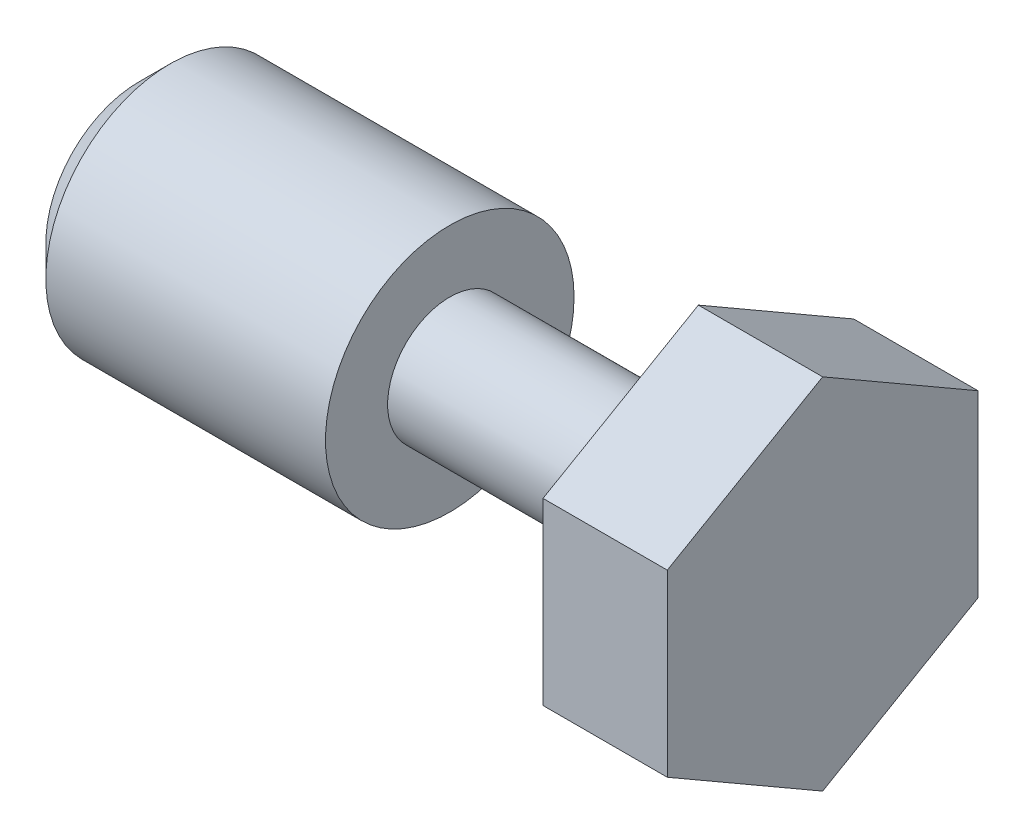
ISO-10303-21;
HEADER;
FILE_DESCRIPTION(('STEP AP214'),'2;1');
FILE_NAME('part.step','',(''),(''),'','','');
FILE_SCHEMA(('AUTOMOTIVE_DESIGN { 1 0 10303 214 1 1 1 1 }'));
ENDSEC;
DATA;
#1=APPLICATION_CONTEXT('core data for automotive mechanical design processes');
#2=APPLICATION_PROTOCOL_DEFINITION('international standard','automotive_design',2000,#1);
#3=PRODUCT_CONTEXT('',#1,'mechanical');
#4=PRODUCT('Part','Part','',(#3));
#5=PRODUCT_RELATED_PRODUCT_CATEGORY('part','',(#4));
#6=PRODUCT_DEFINITION_FORMATION('','',#4);
#7=PRODUCT_DEFINITION_CONTEXT('part definition',#1,'design');
#8=PRODUCT_DEFINITION('design','',#6,#7);
#9=PRODUCT_DEFINITION_SHAPE('','',#8);
#10=(LENGTH_UNIT() NAMED_UNIT(*) SI_UNIT(.MILLI.,.METRE.));
#11=(NAMED_UNIT(*) PLANE_ANGLE_UNIT() SI_UNIT($,.RADIAN.));
#12=(NAMED_UNIT(*) SI_UNIT($,.STERADIAN.) SOLID_ANGLE_UNIT());
#13=UNCERTAINTY_MEASURE_WITH_UNIT(LENGTH_MEASURE(1.E-05),#10,'distance_accuracy_value','');
#14=(GEOMETRIC_REPRESENTATION_CONTEXT(3) GLOBAL_UNCERTAINTY_ASSIGNED_CONTEXT((#13)) GLOBAL_UNIT_ASSIGNED_CONTEXT((#10,
#11,#12)) REPRESENTATION_CONTEXT('',''));
#15=CARTESIAN_POINT('',(0.,0.,0.));
#16=DIRECTION('',(0.,0.,1.));
#17=DIRECTION('',(1.,0.,0.));
#18=AXIS2_PLACEMENT_3D('',#15,#16,#17);
#19=CARTESIAN_POINT('',(5.,0.,0.));
#20=DIRECTION('',(-1.,0.,0.));
#21=DIRECTION('',(0.,0.,1.));
#22=AXIS2_PLACEMENT_3D('',#19,#20,#21);
#23=CYLINDRICAL_SURFACE('',#22,2.);
#24=CARTESIAN_POINT('',(0.5,0.,0.));
#25=DIRECTION('',(1.,0.,0.));
#26=DIRECTION('',(0.,0.,-1.));
#27=AXIS2_PLACEMENT_3D('',#24,#25,#26);
#28=CIRCLE('',#27,2.);
#29=CARTESIAN_POINT('',(0.5,0.,-2.));
#30=VERTEX_POINT('',#29);
#31=EDGE_CURVE('E49',#30,#30,#28,.T.);
#32=ORIENTED_EDGE('',*,*,#31,.T.);
#33=EDGE_LOOP('',(#32));
#34=FACE_BOUND('',#33,.T.);
#35=CARTESIAN_POINT('',(5.,0.,0.));
#36=DIRECTION('',(1.,0.,0.));
#37=DIRECTION('',(0.,0.,-1.));
#38=AXIS2_PLACEMENT_3D('',#35,#36,#37);
#39=CIRCLE('',#38,2.);
#40=CARTESIAN_POINT('',(5.,0.,-2.));
#41=VERTEX_POINT('',#40);
#42=EDGE_CURVE('E148',#41,#41,#39,.T.);
#43=ORIENTED_EDGE('',*,*,#42,.F.);
#44=EDGE_LOOP('',(#43));
#45=FACE_BOUND('',#44,.T.);
#46=ADVANCED_FACE('F39',(#34,#45),#23,.T.);
#47=CARTESIAN_POINT('',(5.,0.,0.));
#48=DIRECTION('',(1.,0.,0.));
#49=DIRECTION('',(0.,0.,-1.));
#50=AXIS2_PLACEMENT_3D('',#47,#48,#49);
#51=PLANE('',#50);
#52=CARTESIAN_POINT('',(5.,0.,0.));
#53=DIRECTION('',(1.,0.,0.));
#54=DIRECTION('',(0.,0.,-1.));
#55=AXIS2_PLACEMENT_3D('',#52,#53,#54);
#56=CIRCLE('',#55,1.);
#57=CARTESIAN_POINT('',(5.,0.,-1.));
#58=VERTEX_POINT('',#57);
#59=EDGE_CURVE('E149',#58,#58,#56,.T.);
#60=ORIENTED_EDGE('',*,*,#59,.F.);
#61=EDGE_LOOP('',(#60));
#62=FACE_BOUND('',#61,.T.);
#63=ORIENTED_EDGE('',*,*,#42,.T.);
#64=EDGE_LOOP('',(#63));
#65=FACE_BOUND('',#64,.T.);
#66=ADVANCED_FACE('F168',(#62,#65),#51,.T.);
#67=CARTESIAN_POINT('',(0.,0.,0.));
#68=DIRECTION('',(1.,0.,0.));
#69=DIRECTION('',(0.,0.,-1.));
#70=AXIS2_PLACEMENT_3D('',#67,#68,#69);
#71=PLANE('',#70);
#72=CARTESIAN_POINT('',(0.,0.,0.));
#73=DIRECTION('',(1.,0.,0.));
#74=DIRECTION('',(0.,0.,-1.));
#75=AXIS2_PLACEMENT_3D('',#72,#73,#74);
#76=CIRCLE('',#75,1.5);
#77=CARTESIAN_POINT('',(0.,0.,-1.5));
#78=VERTEX_POINT('',#77);
#79=EDGE_CURVE('E11',#78,#78,#76,.F.);
#80=ORIENTED_EDGE('',*,*,#79,.T.);
#81=EDGE_LOOP('',(#80));
#82=FACE_BOUND('',#81,.T.);
#83=ADVANCED_FACE('F172',(#82),#71,.F.);
#84=CARTESIAN_POINT('',(9.,0.,0.));
#85=DIRECTION('',(-1.,0.,0.));
#86=DIRECTION('',(0.,0.,1.));
#87=AXIS2_PLACEMENT_3D('',#84,#85,#86);
#88=CYLINDRICAL_SURFACE('',#87,1.);
#89=CARTESIAN_POINT('',(9.,0.,0.));
#90=DIRECTION('',(1.,0.,0.));
#91=DIRECTION('',(0.,0.,-1.));
#92=AXIS2_PLACEMENT_3D('',#89,#90,#91);
#93=CIRCLE('',#92,1.);
#94=CARTESIAN_POINT('',(9.,0.,-1.));
#95=VERTEX_POINT('',#94);
#96=EDGE_CURVE('E145',#95,#95,#93,.T.);
#97=ORIENTED_EDGE('',*,*,#96,.F.);
#98=EDGE_LOOP('',(#97));
#99=FACE_BOUND('',#98,.T.);
#100=ORIENTED_EDGE('',*,*,#59,.T.);
#101=EDGE_LOOP('',(#100));
#102=FACE_BOUND('',#101,.T.);
#103=ADVANCED_FACE('F177',(#99,#102),#88,.T.);
#104=CARTESIAN_POINT('',(11.,-1.44337567297406,2.5));
#105=DIRECTION('',(0.,0.866025403784439,-0.5));
#106=DIRECTION('',(0.,0.5,0.866025403784439));
#107=AXIS2_PLACEMENT_3D('',#104,#105,#106);
#108=PLANE('',#107);
#109=DIRECTION('',(0.,-0.5,-0.866025403784439));
#110=VECTOR('',#109,1.);
#111=CARTESIAN_POINT('',(9.,-1.44337567297406,2.5));
#112=LINE('',#111,#110);
#113=CARTESIAN_POINT('',(9.,-1.44337567297406,2.5));
#114=VERTEX_POINT('',#113);
#115=CARTESIAN_POINT('',(9.,-2.88675134594813,0.));
#116=VERTEX_POINT('',#115);
#117=EDGE_CURVE('E126',#114,#116,#112,.T.);
#118=ORIENTED_EDGE('',*,*,#117,.T.);
#119=DIRECTION('',(-1.,0.,0.));
#120=VECTOR('',#119,1.);
#121=CARTESIAN_POINT('',(11.,-2.88675134594813,0.));
#122=LINE('',#121,#120);
#123=CARTESIAN_POINT('',(11.,-2.88675134594813,0.));
#124=VERTEX_POINT('',#123);
#125=EDGE_CURVE('E143',#124,#116,#122,.T.);
#126=ORIENTED_EDGE('',*,*,#125,.F.);
#127=DIRECTION('',(0.,-0.5,-0.866025403784439));
#128=VECTOR('',#127,1.);
#129=CARTESIAN_POINT('',(11.,-1.44337567297406,2.5));
#130=LINE('',#129,#128);
#131=CARTESIAN_POINT('',(11.,-1.44337567297406,2.5));
#132=VERTEX_POINT('',#131);
#133=EDGE_CURVE('E136',#132,#124,#130,.T.);
#134=ORIENTED_EDGE('',*,*,#133,.F.);
#135=DIRECTION('',(-1.,0.,0.));
#136=VECTOR('',#135,1.);
#137=CARTESIAN_POINT('',(11.,-1.44337567297406,2.5));
#138=LINE('',#137,#136);
#139=EDGE_CURVE('E122',#132,#114,#138,.T.);
#140=ORIENTED_EDGE('',*,*,#139,.T.);
#141=EDGE_LOOP('',(#118,#126,#134,#140));
#142=FACE_BOUND('',#141,.T.);
#143=ADVANCED_FACE('F182',(#142),#108,.F.);
#144=CARTESIAN_POINT('',(11.,-2.88675134594813,0.));
#145=DIRECTION('',(0.,0.866025403784439,0.5));
#146=DIRECTION('',(0.,-0.5,0.866025403784439));
#147=AXIS2_PLACEMENT_3D('',#144,#145,#146);
#148=PLANE('',#147);
#149=DIRECTION('',(0.,0.5,-0.866025403784439));
#150=VECTOR('',#149,1.);
#151=CARTESIAN_POINT('',(9.,-2.88675134594813,0.));
#152=LINE('',#151,#150);
#153=CARTESIAN_POINT('',(9.,-1.44337567297406,-2.5));
#154=VERTEX_POINT('',#153);
#155=EDGE_CURVE('E129',#116,#154,#152,.T.);
#156=ORIENTED_EDGE('',*,*,#155,.T.);
#157=DIRECTION('',(-1.,0.,0.));
#158=VECTOR('',#157,1.);
#159=CARTESIAN_POINT('',(11.,-1.44337567297406,-2.5));
#160=LINE('',#159,#158);
#161=CARTESIAN_POINT('',(11.,-1.44337567297406,-2.5));
#162=VERTEX_POINT('',#161);
#163=EDGE_CURVE('E140',#162,#154,#160,.T.);
#164=ORIENTED_EDGE('',*,*,#163,.F.);
#165=DIRECTION('',(0.,0.5,-0.866025403784439));
#166=VECTOR('',#165,1.);
#167=CARTESIAN_POINT('',(11.,-2.88675134594813,0.));
#168=LINE('',#167,#166);
#169=EDGE_CURVE('E95',#124,#162,#168,.T.);
#170=ORIENTED_EDGE('',*,*,#169,.F.);
#171=ORIENTED_EDGE('',*,*,#125,.T.);
#172=EDGE_LOOP('',(#156,#164,#170,#171));
#173=FACE_BOUND('',#172,.T.);
#174=ADVANCED_FACE('F186',(#173),#148,.F.);
#175=CARTESIAN_POINT('',(11.,-1.44337567297406,-2.5));
#176=DIRECTION('',(0.,0.,1.));
#177=DIRECTION('',(1.,0.,0.));
#178=AXIS2_PLACEMENT_3D('',#175,#176,#177);
#179=PLANE('',#178);
#180=DIRECTION('',(0.,1.,0.));
#181=VECTOR('',#180,1.);
#182=CARTESIAN_POINT('',(9.,-1.44337567297406,-2.5));
#183=LINE('',#182,#181);
#184=CARTESIAN_POINT('',(9.,1.44337567297407,-2.5));
#185=VERTEX_POINT('',#184);
#186=EDGE_CURVE('E131',#154,#185,#183,.T.);
#187=ORIENTED_EDGE('',*,*,#186,.T.);
#188=DIRECTION('',(-1.,0.,0.));
#189=VECTOR('',#188,1.);
#190=CARTESIAN_POINT('',(11.,1.44337567297407,-2.5));
#191=LINE('',#190,#189);
#192=CARTESIAN_POINT('',(11.,1.44337567297407,-2.5));
#193=VERTEX_POINT('',#192);
#194=EDGE_CURVE('E117',#193,#185,#191,.T.);
#195=ORIENTED_EDGE('',*,*,#194,.F.);
#196=DIRECTION('',(0.,1.,0.));
#197=VECTOR('',#196,1.);
#198=CARTESIAN_POINT('',(11.,-1.44337567297406,-2.5));
#199=LINE('',#198,#197);
#200=EDGE_CURVE('E108',#162,#193,#199,.T.);
#201=ORIENTED_EDGE('',*,*,#200,.F.);
#202=ORIENTED_EDGE('',*,*,#163,.T.);
#203=EDGE_LOOP('',(#187,#195,#201,#202));
#204=FACE_BOUND('',#203,.T.);
#205=ADVANCED_FACE('F190',(#204),#179,.F.);
#206=CARTESIAN_POINT('',(11.,1.44337567297407,-2.5));
#207=DIRECTION('',(0.,-0.866025403784439,0.5));
#208=DIRECTION('',(0.,-0.5,-0.866025403784439));
#209=AXIS2_PLACEMENT_3D('',#206,#207,#208);
#210=PLANE('',#209);
#211=DIRECTION('',(0.,0.5,0.866025403784439));
#212=VECTOR('',#211,1.);
#213=CARTESIAN_POINT('',(9.,1.44337567297407,-2.5));
#214=LINE('',#213,#212);
#215=CARTESIAN_POINT('',(9.,2.88675134594813,0.));
#216=VERTEX_POINT('',#215);
#217=EDGE_CURVE('E116',#185,#216,#214,.T.);
#218=ORIENTED_EDGE('',*,*,#217,.T.);
#219=DIRECTION('',(-1.,0.,0.));
#220=VECTOR('',#219,1.);
#221=CARTESIAN_POINT('',(11.,2.88675134594813,0.));
#222=LINE('',#221,#220);
#223=CARTESIAN_POINT('',(11.,2.88675134594813,0.));
#224=VERTEX_POINT('',#223);
#225=EDGE_CURVE('E113',#224,#216,#222,.T.);
#226=ORIENTED_EDGE('',*,*,#225,.F.);
#227=DIRECTION('',(0.,0.5,0.866025403784439));
#228=VECTOR('',#227,1.);
#229=CARTESIAN_POINT('',(11.,1.44337567297407,-2.5));
#230=LINE('',#229,#228);
#231=EDGE_CURVE('E102',#193,#224,#230,.T.);
#232=ORIENTED_EDGE('',*,*,#231,.F.);
#233=ORIENTED_EDGE('',*,*,#194,.T.);
#234=EDGE_LOOP('',(#218,#226,#232,#233));
#235=FACE_BOUND('',#234,.T.);
#236=ADVANCED_FACE('F114',(#235),#210,.F.);
#237=CARTESIAN_POINT('',(11.,2.88675134594813,0.));
#238=DIRECTION('',(0.,-0.866025403784438,-0.5));
#239=DIRECTION('',(0.,0.5,-0.866025403784439));
#240=AXIS2_PLACEMENT_3D('',#237,#238,#239);
#241=PLANE('',#240);
#242=DIRECTION('',(0.,-0.5,0.866025403784439));
#243=VECTOR('',#242,1.);
#244=CARTESIAN_POINT('',(9.,2.88675134594813,0.));
#245=LINE('',#244,#243);
#246=CARTESIAN_POINT('',(9.,1.44337567297406,2.5));
#247=VERTEX_POINT('',#246);
#248=EDGE_CURVE('E80',#216,#247,#245,.T.);
#249=ORIENTED_EDGE('',*,*,#248,.T.);
#250=DIRECTION('',(-1.,0.,0.));
#251=VECTOR('',#250,1.);
#252=CARTESIAN_POINT('',(11.,1.44337567297406,2.5));
#253=LINE('',#252,#251);
#254=CARTESIAN_POINT('',(11.,1.44337567297406,2.5));
#255=VERTEX_POINT('',#254);
#256=EDGE_CURVE('E118',#255,#247,#253,.T.);
#257=ORIENTED_EDGE('',*,*,#256,.F.);
#258=DIRECTION('',(0.,-0.5,0.866025403784439));
#259=VECTOR('',#258,1.);
#260=CARTESIAN_POINT('',(11.,2.88675134594813,0.));
#261=LINE('',#260,#259);
#262=EDGE_CURVE('E106',#224,#255,#261,.T.);
#263=ORIENTED_EDGE('',*,*,#262,.F.);
#264=ORIENTED_EDGE('',*,*,#225,.T.);
#265=EDGE_LOOP('',(#249,#257,#263,#264));
#266=FACE_BOUND('',#265,.T.);
#267=ADVANCED_FACE('F120',(#266),#241,.F.);
#268=CARTESIAN_POINT('',(11.,1.44337567297406,2.5));
#269=DIRECTION('',(0.,0.,-1.));
#270=DIRECTION('',(-1.,0.,0.));
#271=AXIS2_PLACEMENT_3D('',#268,#269,#270);
#272=PLANE('',#271);
#273=DIRECTION('',(0.,-1.,0.));
#274=VECTOR('',#273,1.);
#275=CARTESIAN_POINT('',(9.,1.44337567297406,2.5));
#276=LINE('',#275,#274);
#277=EDGE_CURVE('E86',#247,#114,#276,.T.);
#278=ORIENTED_EDGE('',*,*,#277,.T.);
#279=ORIENTED_EDGE('',*,*,#139,.F.);
#280=DIRECTION('',(0.,-1.,0.));
#281=VECTOR('',#280,1.);
#282=CARTESIAN_POINT('',(11.,1.44337567297406,2.5));
#283=LINE('',#282,#281);
#284=EDGE_CURVE('E57',#255,#132,#283,.T.);
#285=ORIENTED_EDGE('',*,*,#284,.F.);
#286=ORIENTED_EDGE('',*,*,#256,.T.);
#287=EDGE_LOOP('',(#278,#279,#285,#286));
#288=FACE_BOUND('',#287,.T.);
#289=ADVANCED_FACE('F198',(#288),#272,.F.);
#290=CARTESIAN_POINT('',(11.,0.,0.));
#291=DIRECTION('',(1.,0.,0.));
#292=DIRECTION('',(0.,0.,-1.));
#293=AXIS2_PLACEMENT_3D('',#290,#291,#292);
#294=PLANE('',#293);
#295=ORIENTED_EDGE('',*,*,#133,.T.);
#296=ORIENTED_EDGE('',*,*,#169,.T.);
#297=ORIENTED_EDGE('',*,*,#200,.T.);
#298=ORIENTED_EDGE('',*,*,#231,.T.);
#299=ORIENTED_EDGE('',*,*,#262,.T.);
#300=ORIENTED_EDGE('',*,*,#284,.T.);
#301=EDGE_LOOP('',(#295,#296,#297,#298,#299,#300));
#302=FACE_BOUND('',#301,.T.);
#303=ADVANCED_FACE('F104',(#302),#294,.T.);
#304=CARTESIAN_POINT('',(9.,0.,0.));
#305=DIRECTION('',(1.,0.,0.));
#306=DIRECTION('',(0.,0.,-1.));
#307=AXIS2_PLACEMENT_3D('',#304,#305,#306);
#308=PLANE('',#307);
#309=ORIENTED_EDGE('',*,*,#96,.T.);
#310=EDGE_LOOP('',(#309));
#311=FACE_BOUND('',#310,.T.);
#312=ORIENTED_EDGE('',*,*,#117,.F.);
#313=ORIENTED_EDGE('',*,*,#277,.F.);
#314=ORIENTED_EDGE('',*,*,#248,.F.);
#315=ORIENTED_EDGE('',*,*,#217,.F.);
#316=ORIENTED_EDGE('',*,*,#186,.F.);
#317=ORIENTED_EDGE('',*,*,#155,.F.);
#318=EDGE_LOOP('',(#312,#313,#314,#315,#316,#317));
#319=FACE_BOUND('',#318,.T.);
#320=ADVANCED_FACE('F159',(#311,#319),#308,.F.);
#321=CARTESIAN_POINT('',(0.5,0.,0.));
#322=DIRECTION('',(1.,0.,0.));
#323=DIRECTION('',(0.,0.,-1.));
#324=AXIS2_PLACEMENT_3D('',#321,#322,#323);
#325=CONICAL_SURFACE('',#324,2.,0.78539816339745);
#326=ORIENTED_EDGE('',*,*,#79,.F.);
#327=EDGE_LOOP('',(#326));
#328=FACE_BOUND('',#327,.T.);
#329=ORIENTED_EDGE('',*,*,#31,.F.);
#330=EDGE_LOOP('',(#329));
#331=FACE_BOUND('',#330,.T.);
#332=ADVANCED_FACE('F42',(#328,#331),#325,.T.);
#333=CLOSED_SHELL('',(#46,#66,#83,#103,#143,#174,#205,#236,#267,#289,#303,#320,#332));
#334=MANIFOLD_SOLID_BREP('B2',#333);
#335=ADVANCED_BREP_SHAPE_REPRESENTATION('',(#18,#334),#14);
#336=SHAPE_DEFINITION_REPRESENTATION(#9,#335);
ENDSEC;
END-ISO-10303-21;
